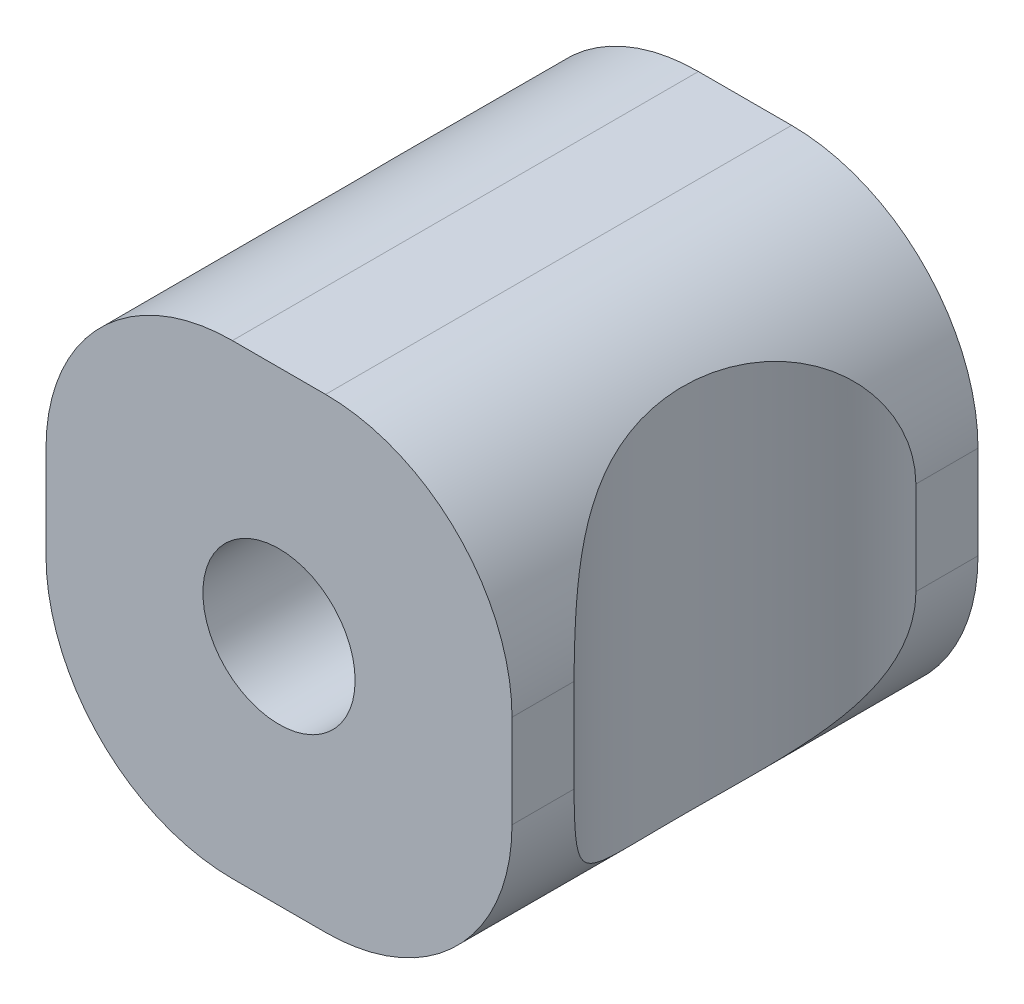
ISO-10303-21;
HEADER;
FILE_DESCRIPTION(('STEP AP214'),'2;1');
FILE_NAME('part.step','',(''),(''),'','','');
FILE_SCHEMA(('AUTOMOTIVE_DESIGN { 1 0 10303 214 1 1 1 1 }'));
ENDSEC;
DATA;
#1=APPLICATION_CONTEXT('core data for automotive mechanical design processes');
#2=APPLICATION_PROTOCOL_DEFINITION('international standard','automotive_design',2000,#1);
#3=PRODUCT_CONTEXT('',#1,'mechanical');
#4=PRODUCT('Part','Part','',(#3));
#5=PRODUCT_RELATED_PRODUCT_CATEGORY('part','',(#4));
#6=PRODUCT_DEFINITION_FORMATION('','',#4);
#7=PRODUCT_DEFINITION_CONTEXT('part definition',#1,'design');
#8=PRODUCT_DEFINITION('design','',#6,#7);
#9=PRODUCT_DEFINITION_SHAPE('','',#8);
#10=(LENGTH_UNIT() NAMED_UNIT(*) SI_UNIT(.MILLI.,.METRE.));
#11=(NAMED_UNIT(*) PLANE_ANGLE_UNIT() SI_UNIT($,.RADIAN.));
#12=(NAMED_UNIT(*) SI_UNIT($,.STERADIAN.) SOLID_ANGLE_UNIT());
#13=UNCERTAINTY_MEASURE_WITH_UNIT(LENGTH_MEASURE(1.E-05),#10,'distance_accuracy_value','');
#14=(GEOMETRIC_REPRESENTATION_CONTEXT(3) GLOBAL_UNCERTAINTY_ASSIGNED_CONTEXT((#13)) GLOBAL_UNIT_ASSIGNED_CONTEXT((#10,
#11,#12)) REPRESENTATION_CONTEXT('',''));
#15=CARTESIAN_POINT('',(0.,0.,0.));
#16=DIRECTION('',(0.,0.,1.));
#17=DIRECTION('',(1.,0.,0.));
#18=AXIS2_PLACEMENT_3D('',#15,#16,#17);
#19=CARTESIAN_POINT('',(7.5,7.5,15.));
#20=DIRECTION('',(-1.,0.,0.));
#21=DIRECTION('',(0.,-1.,0.));
#22=AXIS2_PLACEMENT_3D('',#19,#20,#21);
#23=PLANE('',#22);
#24=DIRECTION('',(0.,0.,-1.));
#25=VECTOR('',#24,1.);
#26=CARTESIAN_POINT('',(7.5,-1.5,15.));
#27=LINE('',#26,#25);
#28=CARTESIAN_POINT('',(7.5,-1.5,15.));
#29=VERTEX_POINT('',#28);
#30=CARTESIAN_POINT('',(7.5,-1.5,13.));
#31=VERTEX_POINT('',#30);
#32=EDGE_CURVE('E152',#29,#31,#27,.T.);
#33=ORIENTED_EDGE('',*,*,#32,.T.);
#34=DIRECTION('',(0.,1.,0.));
#35=VECTOR('',#34,1.);
#36=CARTESIAN_POINT('',(7.5,-7.5,13.));
#37=LINE('',#36,#35);
#38=CARTESIAN_POINT('',(7.5,1.5,13.));
#39=VERTEX_POINT('',#38);
#40=EDGE_CURVE('E132',#31,#39,#37,.T.);
#41=ORIENTED_EDGE('',*,*,#40,.T.);
#42=DIRECTION('',(0.,0.,-1.));
#43=VECTOR('',#42,1.);
#44=CARTESIAN_POINT('',(7.5,1.5,15.));
#45=LINE('',#44,#43);
#46=CARTESIAN_POINT('',(7.5,1.5,15.));
#47=VERTEX_POINT('',#46);
#48=EDGE_CURVE('E155',#39,#47,#45,.F.);
#49=ORIENTED_EDGE('',*,*,#48,.T.);
#50=DIRECTION('',(0.,1.,0.));
#51=VECTOR('',#50,1.);
#52=CARTESIAN_POINT('',(7.5,7.5,15.));
#53=LINE('',#52,#51);
#54=EDGE_CURVE('E239',#29,#47,#53,.T.);
#55=ORIENTED_EDGE('',*,*,#54,.F.);
#56=EDGE_LOOP('',(#33,#41,#49,#55));
#57=FACE_BOUND('',#56,.T.);
#58=ADVANCED_FACE('F37',(#57),#23,.F.);
#59=CARTESIAN_POINT('',(-7.5,7.5,15.));
#60=DIRECTION('',(1.,0.,0.));
#61=DIRECTION('',(0.,1.,0.));
#62=AXIS2_PLACEMENT_3D('',#59,#60,#61);
#63=PLANE('',#62);
#64=DIRECTION('',(0.,0.,-1.));
#65=VECTOR('',#64,1.);
#66=CARTESIAN_POINT('',(-7.5,1.5,15.));
#67=LINE('',#66,#65);
#68=CARTESIAN_POINT('',(-7.5,1.5,15.));
#69=VERTEX_POINT('',#68);
#70=CARTESIAN_POINT('',(-7.5,1.5,13.));
#71=VERTEX_POINT('',#70);
#72=EDGE_CURVE('E224',#69,#71,#67,.T.);
#73=ORIENTED_EDGE('',*,*,#72,.T.);
#74=DIRECTION('',(0.,-1.,0.));
#75=VECTOR('',#74,1.);
#76=CARTESIAN_POINT('',(-7.5,7.5,13.));
#77=LINE('',#76,#75);
#78=CARTESIAN_POINT('',(-7.5,-1.5,13.));
#79=VERTEX_POINT('',#78);
#80=EDGE_CURVE('E65',#71,#79,#77,.T.);
#81=ORIENTED_EDGE('',*,*,#80,.T.);
#82=DIRECTION('',(0.,0.,-1.));
#83=VECTOR('',#82,1.);
#84=CARTESIAN_POINT('',(-7.5,-1.5,15.));
#85=LINE('',#84,#83);
#86=CARTESIAN_POINT('',(-7.5,-1.5,15.));
#87=VERTEX_POINT('',#86);
#88=EDGE_CURVE('E215',#79,#87,#85,.F.);
#89=ORIENTED_EDGE('',*,*,#88,.T.);
#90=DIRECTION('',(0.,-1.,0.));
#91=VECTOR('',#90,1.);
#92=CARTESIAN_POINT('',(-7.5,7.5,15.));
#93=LINE('',#92,#91);
#94=EDGE_CURVE('E283',#69,#87,#93,.T.);
#95=ORIENTED_EDGE('',*,*,#94,.F.);
#96=EDGE_LOOP('',(#73,#81,#89,#95));
#97=FACE_BOUND('',#96,.T.);
#98=ADVANCED_FACE('F282',(#97),#63,.F.);
#99=CARTESIAN_POINT('',(7.5,1.5,0.));
#100=VERTEX_POINT('',#99);
#101=CARTESIAN_POINT('',(7.5,1.5,2.));
#102=VERTEX_POINT('',#101);
#103=EDGE_CURVE('E146',#100,#102,#45,.F.);
#104=ORIENTED_EDGE('',*,*,#103,.T.);
#105=DIRECTION('',(0.,1.,0.));
#106=VECTOR('',#105,1.);
#107=CARTESIAN_POINT('',(7.5,-7.5,2.));
#108=LINE('',#107,#106);
#109=CARTESIAN_POINT('',(7.5,-1.5,2.));
#110=VERTEX_POINT('',#109);
#111=EDGE_CURVE('E57',#110,#102,#108,.T.);
#112=ORIENTED_EDGE('',*,*,#111,.F.);
#113=CARTESIAN_POINT('',(7.5,-1.5,0.));
#114=VERTEX_POINT('',#113);
#115=EDGE_CURVE('E143',#110,#114,#27,.T.);
#116=ORIENTED_EDGE('',*,*,#115,.T.);
#117=DIRECTION('',(0.,1.,0.));
#118=VECTOR('',#117,1.);
#119=CARTESIAN_POINT('',(7.5,7.5,0.));
#120=LINE('',#119,#118);
#121=EDGE_CURVE('E262',#114,#100,#120,.T.);
#122=ORIENTED_EDGE('',*,*,#121,.T.);
#123=EDGE_LOOP('',(#104,#112,#116,#122));
#124=FACE_BOUND('',#123,.T.);
#125=ADVANCED_FACE('F141',(#124),#23,.F.);
#126=CARTESIAN_POINT('',(-7.5,7.5,15.));
#127=DIRECTION('',(0.,-1.,0.));
#128=DIRECTION('',(0.,0.,-1.));
#129=AXIS2_PLACEMENT_3D('',#126,#127,#128);
#130=PLANE('',#129);
#131=DIRECTION('',(-1.,0.,0.));
#132=VECTOR('',#131,1.);
#133=CARTESIAN_POINT('',(-7.5,7.5,15.));
#134=LINE('',#133,#132);
#135=CARTESIAN_POINT('',(1.5,7.5,15.));
#136=VERTEX_POINT('',#135);
#137=CARTESIAN_POINT('',(-1.5,7.5,15.));
#138=VERTEX_POINT('',#137);
#139=EDGE_CURVE('E246',#136,#138,#134,.T.);
#140=ORIENTED_EDGE('',*,*,#139,.F.);
#141=DIRECTION('',(0.,0.,-1.));
#142=VECTOR('',#141,1.);
#143=CARTESIAN_POINT('',(1.5,7.5,15.));
#144=LINE('',#143,#142);
#145=CARTESIAN_POINT('',(1.5,7.5,0.));
#146=VERTEX_POINT('',#145);
#147=EDGE_CURVE('E160',#136,#146,#144,.T.);
#148=ORIENTED_EDGE('',*,*,#147,.T.);
#149=DIRECTION('',(-1.,0.,0.));
#150=VECTOR('',#149,1.);
#151=CARTESIAN_POINT('',(-7.5,7.5,0.));
#152=LINE('',#151,#150);
#153=CARTESIAN_POINT('',(-1.5,7.5,0.));
#154=VERTEX_POINT('',#153);
#155=EDGE_CURVE('E255',#146,#154,#152,.T.);
#156=ORIENTED_EDGE('',*,*,#155,.T.);
#157=DIRECTION('',(0.,0.,-1.));
#158=VECTOR('',#157,1.);
#159=CARTESIAN_POINT('',(-1.5,7.5,15.));
#160=LINE('',#159,#158);
#161=EDGE_CURVE('E154',#154,#138,#160,.F.);
#162=ORIENTED_EDGE('',*,*,#161,.T.);
#163=EDGE_LOOP('',(#140,#148,#156,#162));
#164=FACE_BOUND('',#163,.T.);
#165=ADVANCED_FACE('F254',(#164),#130,.F.);
#166=CARTESIAN_POINT('',(-7.5,-1.5,0.));
#167=VERTEX_POINT('',#166);
#168=CARTESIAN_POINT('',(-7.5,-1.5,2.));
#169=VERTEX_POINT('',#168);
#170=EDGE_CURVE('E213',#167,#169,#85,.F.);
#171=ORIENTED_EDGE('',*,*,#170,.T.);
#172=DIRECTION('',(0.,-1.,0.));
#173=VECTOR('',#172,1.);
#174=CARTESIAN_POINT('',(-7.5,7.5,2.));
#175=LINE('',#174,#173);
#176=CARTESIAN_POINT('',(-7.5,1.5,2.));
#177=VERTEX_POINT('',#176);
#178=EDGE_CURVE('E137',#177,#169,#175,.T.);
#179=ORIENTED_EDGE('',*,*,#178,.F.);
#180=CARTESIAN_POINT('',(-7.5,1.5,0.));
#181=VERTEX_POINT('',#180);
#182=EDGE_CURVE('E279',#177,#181,#67,.T.);
#183=ORIENTED_EDGE('',*,*,#182,.T.);
#184=DIRECTION('',(0.,-1.,0.));
#185=VECTOR('',#184,1.);
#186=CARTESIAN_POINT('',(-7.5,7.5,0.));
#187=LINE('',#186,#185);
#188=EDGE_CURVE('E219',#181,#167,#187,.T.);
#189=ORIENTED_EDGE('',*,*,#188,.T.);
#190=EDGE_LOOP('',(#171,#179,#183,#189));
#191=FACE_BOUND('',#190,.T.);
#192=ADVANCED_FACE('F217',(#191),#63,.F.);
#193=CARTESIAN_POINT('',(-7.5,-7.5,15.));
#194=DIRECTION('',(0.,1.,0.));
#195=DIRECTION('',(0.,0.,1.));
#196=AXIS2_PLACEMENT_3D('',#193,#194,#195);
#197=PLANE('',#196);
#198=DIRECTION('',(1.,0.,0.));
#199=VECTOR('',#198,1.);
#200=CARTESIAN_POINT('',(-7.5,-7.5,15.));
#201=LINE('',#200,#199);
#202=CARTESIAN_POINT('',(-1.5,-7.5,15.));
#203=VERTEX_POINT('',#202);
#204=CARTESIAN_POINT('',(1.5,-7.5,15.));
#205=VERTEX_POINT('',#204);
#206=EDGE_CURVE('E273',#203,#205,#201,.T.);
#207=ORIENTED_EDGE('',*,*,#206,.F.);
#208=DIRECTION('',(0.,0.,-1.));
#209=VECTOR('',#208,1.);
#210=CARTESIAN_POINT('',(-1.5,-7.5,15.));
#211=LINE('',#210,#209);
#212=CARTESIAN_POINT('',(-1.5,-7.5,0.));
#213=VERTEX_POINT('',#212);
#214=EDGE_CURVE('E272',#203,#213,#211,.T.);
#215=ORIENTED_EDGE('',*,*,#214,.T.);
#216=DIRECTION('',(1.,0.,0.));
#217=VECTOR('',#216,1.);
#218=CARTESIAN_POINT('',(-7.5,-7.5,0.));
#219=LINE('',#218,#217);
#220=CARTESIAN_POINT('',(1.5,-7.5,0.));
#221=VERTEX_POINT('',#220);
#222=EDGE_CURVE('E247',#213,#221,#219,.T.);
#223=ORIENTED_EDGE('',*,*,#222,.T.);
#224=DIRECTION('',(0.,0.,-1.));
#225=VECTOR('',#224,1.);
#226=CARTESIAN_POINT('',(1.5,-7.5,15.));
#227=LINE('',#226,#225);
#228=EDGE_CURVE('E270',#221,#205,#227,.F.);
#229=ORIENTED_EDGE('',*,*,#228,.T.);
#230=EDGE_LOOP('',(#207,#215,#223,#229));
#231=FACE_BOUND('',#230,.T.);
#232=ADVANCED_FACE('F290',(#231),#197,.F.);
#233=CARTESIAN_POINT('',(0.,0.,15.));
#234=DIRECTION('',(0.,0.,1.));
#235=DIRECTION('',(1.,0.,0.));
#236=AXIS2_PLACEMENT_3D('',#233,#234,#235);
#237=PLANE('',#236);
#238=CARTESIAN_POINT('',(0.,0.,15.));
#239=DIRECTION('',(0.,0.,1.));
#240=DIRECTION('',(1.,0.,0.));
#241=AXIS2_PLACEMENT_3D('',#238,#239,#240);
#242=CIRCLE('',#241,2.45);
#243=CARTESIAN_POINT('',(2.45,0.,15.));
#244=VERTEX_POINT('',#243);
#245=EDGE_CURVE('E184',#244,#244,#242,.T.);
#246=ORIENTED_EDGE('',*,*,#245,.F.);
#247=EDGE_LOOP('',(#246));
#248=FACE_BOUND('',#247,.T.);
#249=ORIENTED_EDGE('',*,*,#94,.T.);
#250=CARTESIAN_POINT('',(-1.5,-1.5,15.));
#251=DIRECTION('',(0.,0.,1.));
#252=DIRECTION('',(1.,0.,0.));
#253=AXIS2_PLACEMENT_3D('',#250,#251,#252);
#254=CIRCLE('',#253,6.);
#255=EDGE_CURVE('E230',#87,#203,#254,.T.);
#256=ORIENTED_EDGE('',*,*,#255,.T.);
#257=ORIENTED_EDGE('',*,*,#206,.T.);
#258=CARTESIAN_POINT('',(1.5,-1.5,15.));
#259=DIRECTION('',(0.,0.,1.));
#260=DIRECTION('',(1.,0.,0.));
#261=AXIS2_PLACEMENT_3D('',#258,#259,#260);
#262=CIRCLE('',#261,6.);
#263=EDGE_CURVE('E229',#205,#29,#262,.T.);
#264=ORIENTED_EDGE('',*,*,#263,.T.);
#265=ORIENTED_EDGE('',*,*,#54,.T.);
#266=CARTESIAN_POINT('',(1.5,1.5,15.));
#267=DIRECTION('',(0.,0.,1.));
#268=DIRECTION('',(1.,0.,0.));
#269=AXIS2_PLACEMENT_3D('',#266,#267,#268);
#270=CIRCLE('',#269,6.);
#271=EDGE_CURVE('E222',#47,#136,#270,.T.);
#272=ORIENTED_EDGE('',*,*,#271,.T.);
#273=ORIENTED_EDGE('',*,*,#139,.T.);
#274=CARTESIAN_POINT('',(-1.5,1.5,15.));
#275=DIRECTION('',(0.,0.,1.));
#276=DIRECTION('',(1.,0.,0.));
#277=AXIS2_PLACEMENT_3D('',#274,#275,#276);
#278=CIRCLE('',#277,6.);
#279=EDGE_CURVE('E220',#138,#69,#278,.T.);
#280=ORIENTED_EDGE('',*,*,#279,.T.);
#281=EDGE_LOOP('',(#249,#256,#257,#264,#265,#272,#273,#280));
#282=FACE_BOUND('',#281,.T.);
#283=ADVANCED_FACE('F242',(#248,#282),#237,.T.);
#284=CARTESIAN_POINT('',(0.,0.,0.));
#285=DIRECTION('',(0.,0.,1.));
#286=DIRECTION('',(1.,0.,0.));
#287=AXIS2_PLACEMENT_3D('',#284,#285,#286);
#288=PLANE('',#287);
#289=ORIENTED_EDGE('',*,*,#222,.F.);
#290=CARTESIAN_POINT('',(-1.5,-1.5,0.));
#291=DIRECTION('',(0.,0.,1.));
#292=DIRECTION('',(1.,0.,0.));
#293=AXIS2_PLACEMENT_3D('',#290,#291,#292);
#294=CIRCLE('',#293,6.);
#295=EDGE_CURVE('E278',#213,#167,#294,.F.);
#296=ORIENTED_EDGE('',*,*,#295,.T.);
#297=ORIENTED_EDGE('',*,*,#188,.F.);
#298=CARTESIAN_POINT('',(-1.5,1.5,0.));
#299=DIRECTION('',(0.,0.,1.));
#300=DIRECTION('',(1.,0.,0.));
#301=AXIS2_PLACEMENT_3D('',#298,#299,#300);
#302=CIRCLE('',#301,6.);
#303=EDGE_CURVE('E261',#181,#154,#302,.F.);
#304=ORIENTED_EDGE('',*,*,#303,.T.);
#305=ORIENTED_EDGE('',*,*,#155,.F.);
#306=CARTESIAN_POINT('',(1.5,1.5,0.));
#307=DIRECTION('',(0.,0.,1.));
#308=DIRECTION('',(1.,0.,0.));
#309=AXIS2_PLACEMENT_3D('',#306,#307,#308);
#310=CIRCLE('',#309,6.);
#311=EDGE_CURVE('E250',#146,#100,#310,.F.);
#312=ORIENTED_EDGE('',*,*,#311,.T.);
#313=ORIENTED_EDGE('',*,*,#121,.F.);
#314=CARTESIAN_POINT('',(1.5,-1.5,0.));
#315=DIRECTION('',(0.,0.,1.));
#316=DIRECTION('',(1.,0.,0.));
#317=AXIS2_PLACEMENT_3D('',#314,#315,#316);
#318=CIRCLE('',#317,6.);
#319=EDGE_CURVE('E150',#114,#221,#318,.F.);
#320=ORIENTED_EDGE('',*,*,#319,.T.);
#321=EDGE_LOOP('',(#289,#296,#297,#304,#305,#312,#313,#320));
#322=FACE_BOUND('',#321,.T.);
#323=ADVANCED_FACE('F259',(#322),#288,.F.);
#324=CARTESIAN_POINT('',(0.,0.,5.));
#325=DIRECTION('',(0.,0.,1.));
#326=DIRECTION('',(1.,0.,0.));
#327=AXIS2_PLACEMENT_3D('',#324,#325,#326);
#328=CYLINDRICAL_SURFACE('',#327,2.45);
#329=CARTESIAN_POINT('',(0.,0.,5.));
#330=DIRECTION('',(0.,0.,1.));
#331=DIRECTION('',(1.,0.,0.));
#332=AXIS2_PLACEMENT_3D('',#329,#330,#331);
#333=CIRCLE('',#332,2.45);
#334=CARTESIAN_POINT('',(2.45,0.,5.));
#335=VERTEX_POINT('',#334);
#336=EDGE_CURVE('E186',#335,#335,#333,.T.);
#337=ORIENTED_EDGE('',*,*,#336,.F.);
#338=EDGE_LOOP('',(#337));
#339=FACE_BOUND('',#338,.T.);
#340=ORIENTED_EDGE('',*,*,#245,.T.);
#341=EDGE_LOOP('',(#340));
#342=FACE_BOUND('',#341,.T.);
#343=ADVANCED_FACE('F396',(#339,#342),#328,.F.);
#344=CARTESIAN_POINT('',(0.,0.,5.));
#345=DIRECTION('',(0.,0.,1.));
#346=DIRECTION('',(1.,0.,0.));
#347=AXIS2_PLACEMENT_3D('',#344,#345,#346);
#348=PLANE('',#347);
#349=ORIENTED_EDGE('',*,*,#336,.T.);
#350=EDGE_LOOP('',(#349));
#351=FACE_BOUND('',#350,.T.);
#352=ADVANCED_FACE('F172',(#351),#348,.T.);
#353=CARTESIAN_POINT('',(-1.5,-1.5,15.));
#354=DIRECTION('',(0.,0.,-1.));
#355=DIRECTION('',(-1.,0.,0.));
#356=AXIS2_PLACEMENT_3D('',#353,#354,#355);
#357=CYLINDRICAL_SURFACE('',#356,6.);
#358=CARTESIAN_POINT('',(-7.5,-1.5,2.));
#359=CARTESIAN_POINT('',(-7.50002404857424,-1.61256687190926,1.99999925949167));
#360=CARTESIAN_POINT('',(-7.49683312324728,-1.72513046825298,2.00377950726603));
#361=CARTESIAN_POINT('',(-7.48419493546309,-1.94938170838499,2.01889720139936));
#362=CARTESIAN_POINT('',(-7.47474847290634,-2.0610694623206,2.03023368153813));
#363=CARTESIAN_POINT('',(-7.44980392034766,-2.28245210195422,2.06042132897403));
#364=CARTESIAN_POINT('',(-7.43432099972977,-2.39215126736925,2.0792536619462));
#365=CARTESIAN_POINT('',(-7.3976406065648,-2.609019526754,2.12441569880627));
#366=CARTESIAN_POINT('',(-7.37644317307674,-2.71618863801134,2.15074535144964));
#367=CARTESIAN_POINT('',(-7.32878480762767,-2.92722542721304,2.21086454716305));
#368=CARTESIAN_POINT('',(-7.30232326326927,-3.03109271941006,2.24465495822657));
#369=CARTESIAN_POINT('',(-7.24470228845344,-3.23482229956922,2.31962585788643));
#370=CARTESIAN_POINT('',(-7.21354104218815,-3.33468302056332,2.3608092040412));
#371=CARTESIAN_POINT('',(-7.14721971174767,-3.52965587493604,2.45040563849978));
#372=CARTESIAN_POINT('',(-7.11206177306525,-3.62477051699771,2.49881485216323));
#373=CARTESIAN_POINT('',(-7.03849271786564,-3.80976830462762,2.60267527385834));
#374=CARTESIAN_POINT('',(-7.00008037707521,-3.89964945976464,2.6581291359688));
#375=CARTESIAN_POINT('',(-6.88147141484879,-4.16006630035942,2.83425903304444));
#376=CARTESIAN_POINT('',(-6.79760151750534,-4.32222907013774,2.96509585468399));
#377=CARTESIAN_POINT('',(-6.62687791154466,-4.62169461249579,3.25080943184904));
#378=CARTESIAN_POINT('',(-6.54002304225485,-4.75898758158669,3.40569562296917));
#379=CARTESIAN_POINT('',(-6.36168103601423,-5.0201313123863,3.75101641079101));
#380=CARTESIAN_POINT('',(-6.27050002768458,-5.14159304678909,3.94340872542384));
#381=CARTESIAN_POINT('',(-6.09844793701373,-5.3565943421833,4.34745949286852));
#382=CARTESIAN_POINT('',(-6.01758228121759,-5.45011924101065,4.55912798667565));
#383=CARTESIAN_POINT('',(-5.90166634241313,-5.57790446133262,4.90476703911668));
#384=CARTESIAN_POINT('',(-5.86162691392041,-5.62056804729744,5.03408401642191));
#385=CARTESIAN_POINT('',(-5.7872080785979,-5.69794463674898,5.29669638701399));
#386=CARTESIAN_POINT('',(-5.75282917772783,-5.73265692962692,5.42999213468208));
#387=CARTESIAN_POINT('',(-5.6902350282012,-5.79463260651792,5.69978265410738));
#388=CARTESIAN_POINT('',(-5.66202277599781,-5.82189237085839,5.83627894553898));
#389=CARTESIAN_POINT('',(-5.61214251375491,-5.86937846590774,6.11167345188594));
#390=CARTESIAN_POINT('',(-5.59047504447351,-5.88960421545695,6.25057186427298));
#391=CARTESIAN_POINT('',(-5.5509055842329,-5.92617374313284,6.55333029682975));
#392=CARTESIAN_POINT('',(-5.53422997823462,-5.94131166692222,6.71749824776955));
#393=CARTESIAN_POINT('',(-5.5103892509947,-5.96285036305846,7.04709990381175));
#394=CARTESIAN_POINT('',(-5.50322510164244,-5.96925024254581,7.21253373652633));
#395=CARTESIAN_POINT('',(-5.49850864602218,-5.97347065398791,7.54379052114755));
#396=CARTESIAN_POINT('',(-5.50096453841836,-5.97128386796777,7.70961368454114));
#397=CARTESIAN_POINT('',(-5.51547166543653,-5.95825982640702,8.04049952911523));
#398=CARTESIAN_POINT('',(-5.52752301587435,-5.94742246645519,8.20556220109252));
#399=CARTESIAN_POINT('',(-5.56236510277595,-5.91563087054742,8.54679461012343));
#400=CARTESIAN_POINT('',(-5.58592431454021,-5.89394953061876,8.72281960136356));
#401=CARTESIAN_POINT('',(-5.64358316254756,-5.83961827898493,9.07145264878948));
#402=CARTESIAN_POINT('',(-5.67768421195327,-5.80696689666413,9.24406024356092));
#403=CARTESIAN_POINT('',(-5.75569437334342,-5.72990171191713,9.58417689473805));
#404=CARTESIAN_POINT('',(-5.79959301095862,-5.68550046165245,9.75169118057302));
#405=CARTESIAN_POINT('',(-5.89619989405571,-5.58391219935112,10.0801593188032));
#406=CARTESIAN_POINT('',(-5.94890527390579,-5.52672934429214,10.2411152840925));
#407=CARTESIAN_POINT('',(-6.04813927093053,-5.41390150206076,10.5170321754056));
#408=CARTESIAN_POINT('',(-6.09311253155414,-5.36118380074465,10.6337576587293));
#409=CARTESIAN_POINT('',(-6.18649656429051,-5.24728878130392,10.8615646657724));
#410=CARTESIAN_POINT('',(-6.2349066806917,-5.18611307476812,10.9726472591879));
#411=CARTESIAN_POINT('',(-6.33415789436076,-5.05495060155074,11.1882533864597));
#412=CARTESIAN_POINT('',(-6.38499761449066,-4.9849687904173,11.2927805601262));
#413=CARTESIAN_POINT('',(-6.4879766379651,-4.83590940906887,11.4944741292139));
#414=CARTESIAN_POINT('',(-6.54011596721054,-4.75683165746025,11.5916403777775));
#415=CARTESIAN_POINT('',(-6.6447836753114,-4.58886135318112,11.7784866836479));
#416=CARTESIAN_POINT('',(-6.69731193718571,-4.49989747522346,11.8681028762599));
#417=CARTESIAN_POINT('',(-6.80088233785463,-4.3128400015099,12.0381971014719));
#418=CARTESIAN_POINT('',(-6.85192466284716,-4.214747556146,12.1186762826979));
#419=CARTESIAN_POINT('',(-6.95100502837301,-4.00987779764788,12.2698234413881));
#420=CARTESIAN_POINT('',(-6.99904342731273,-3.90310152411501,12.3404925905455));
#421=CARTESIAN_POINT('',(-7.09062192878084,-3.68158192135095,12.4714902080678));
#422=CARTESIAN_POINT('',(-7.13416283615149,-3.56684002376341,12.5318205278814));
#423=CARTESIAN_POINT('',(-7.21001626349293,-3.34594277056438,12.6345298737115));
#424=CARTESIAN_POINT('',(-7.24305236178796,-3.24064566712371,12.6782265587835));
#425=CARTESIAN_POINT('',(-7.30389401411943,-3.02554927401929,12.7573896084027));
#426=CARTESIAN_POINT('',(-7.33170021675025,-2.91575054469212,12.792856993648));
#427=CARTESIAN_POINT('',(-7.38138351791712,-2.69263390570974,12.8554352208899));
#428=CARTESIAN_POINT('',(-7.40326737953631,-2.57932017635259,12.8825555997454));
#429=CARTESIAN_POINT('',(-7.44061852257864,-2.3500234268674,12.9284403453893));
#430=CARTESIAN_POINT('',(-7.45608866848784,-2.23404162283378,12.9472084427394));
#431=CARTESIAN_POINT('',(-7.47872683644316,-2.01511887251608,12.974543249644));
#432=CARTESIAN_POINT('',(-7.48669704394678,-1.91238246094462,12.9840995113773));
#433=CARTESIAN_POINT('',(-7.4973368219732,-1.70643265588378,12.9968218649302));
#434=CARTESIAN_POINT('',(-7.50001613425974,-1.60322049039294,12.9999997010865));
#435=CARTESIAN_POINT('',(-7.5,-1.5,13.));
#436=B_SPLINE_CURVE_WITH_KNOTS('',3,(#358,#359,#360,#361,#362,#363,#364,#365,#366,#367,#368,
#369,#370,#371,#372,#373,#374,#375,#376,#377,#378,#379,#380,#381,#382,#383,#384,#385,#386,#387,
#388,#389,#390,#391,#392,#393,#394,#395,#396,#397,#398,#399,#400,#401,#402,#403,#404,#405,#406,
#407,#408,#409,#410,#411,#412,#413,#414,#415,#416,#417,#418,#419,#420,#421,#422,#423,#424,#425,
#426,#427,#428,#429,#430,#431,#432,#433,#434,#435),.UNSPECIFIED.,.F.,.F.,(4,2,2,2,2,2,2,2,2,2,2,
2,2,2,2,2,2,2,2,2,2,2,2,2,2,2,2,2,2,2,2,2,2,2,2,2,2,2,4),(0.,0.33758712137078,0.675131083542706,
1.01183222215537,1.34853105945547,1.68526908935743,2.02213755847658,2.35882603727902,
2.69564174212032,3.36634881297558,4.03731969889914,4.76985153812458,5.5027671612179,
5.92823648857022,6.35374382538532,6.77945746425699,7.20520626780536,7.7017942293682,
8.19843292884172,8.69549497985034,9.19256303041856,9.72863389650228,10.2647766555591,
10.8003489595347,11.3357473314366,11.7425955187119,12.1493662916713,12.5559091736017,
12.9624601643232,13.3721624073838,13.7818130890598,14.1914148005986,14.6009430849866,
14.9565570522838,15.3121268883905,15.6672889475578,16.022292213347,16.3324260652336,
16.6419883544454),.UNSPECIFIED.);
#437=EDGE_CURVE('E176',#169,#79,#436,.T.);
#438=ORIENTED_EDGE('',*,*,#437,.F.);
#439=ORIENTED_EDGE('',*,*,#170,.F.);
#440=ORIENTED_EDGE('',*,*,#295,.F.);
#441=ORIENTED_EDGE('',*,*,#214,.F.);
#442=ORIENTED_EDGE('',*,*,#255,.F.);
#443=ORIENTED_EDGE('',*,*,#88,.F.);
#444=EDGE_LOOP('',(#438,#439,#440,#441,#442,#443));
#445=FACE_BOUND('',#444,.T.);
#446=ADVANCED_FACE('F188',(#445),#357,.T.);
#447=CARTESIAN_POINT('',(1.5,-1.5,15.));
#448=DIRECTION('',(0.,0.,-1.));
#449=DIRECTION('',(-1.,0.,0.));
#450=AXIS2_PLACEMENT_3D('',#447,#448,#449);
#451=CYLINDRICAL_SURFACE('',#450,6.);
#452=CARTESIAN_POINT('',(7.5,-1.5,13.));
#453=CARTESIAN_POINT('',(7.50002404857424,-1.61256687190926,13.0000007405083));
#454=CARTESIAN_POINT('',(7.49683312324728,-1.72513046825298,12.996220492734));
#455=CARTESIAN_POINT('',(7.48419493546309,-1.94938170838499,12.9811027986006));
#456=CARTESIAN_POINT('',(7.47474847290634,-2.0610694623206,12.9697663184619));
#457=CARTESIAN_POINT('',(7.44980392034766,-2.28245210195422,12.939578671026));
#458=CARTESIAN_POINT('',(7.43432099972977,-2.39215126736925,12.9207463380538));
#459=CARTESIAN_POINT('',(7.3976406065648,-2.609019526754,12.8755843011937));
#460=CARTESIAN_POINT('',(7.37644317307674,-2.71618863801134,12.8492546485503));
#461=CARTESIAN_POINT('',(7.32878480762767,-2.92722542721303,12.7891354528369));
#462=CARTESIAN_POINT('',(7.30232326326927,-3.03109271941006,12.7553450417734));
#463=CARTESIAN_POINT('',(7.24470228845344,-3.23482229956922,12.6803741421136));
#464=CARTESIAN_POINT('',(7.21354104218815,-3.33468302056332,12.6391907959588));
#465=CARTESIAN_POINT('',(7.14721971174767,-3.52965587493604,12.5495943615002));
#466=CARTESIAN_POINT('',(7.11206177306525,-3.62477051699771,12.5011851478368));
#467=CARTESIAN_POINT('',(7.03849271786564,-3.80976830462762,12.3973247261416));
#468=CARTESIAN_POINT('',(7.00008037707521,-3.89964945976464,12.3418708640312));
#469=CARTESIAN_POINT('',(6.88147141484879,-4.16006630035942,12.1657409669556));
#470=CARTESIAN_POINT('',(6.79760151750534,-4.32222907013774,12.034904145316));
#471=CARTESIAN_POINT('',(6.62687791154466,-4.62169461249578,11.7491905681509));
#472=CARTESIAN_POINT('',(6.54002304225485,-4.75898758158668,11.5943043770308));
#473=CARTESIAN_POINT('',(6.36168103601423,-5.0201313123863,11.248983589209));
#474=CARTESIAN_POINT('',(6.27050002768458,-5.14159304678909,11.0565912745762));
#475=CARTESIAN_POINT('',(6.09844793701373,-5.3565943421833,10.6525405071315));
#476=CARTESIAN_POINT('',(6.01758228121759,-5.45011924101065,10.4408720133243));
#477=CARTESIAN_POINT('',(5.90166634241313,-5.57790446133262,10.0952329608833));
#478=CARTESIAN_POINT('',(5.86162691392041,-5.62056804729744,9.96591598357808));
#479=CARTESIAN_POINT('',(5.7872080785979,-5.69794463674898,9.703303612986));
#480=CARTESIAN_POINT('',(5.75282917772783,-5.73265692962692,9.57000786531791));
#481=CARTESIAN_POINT('',(5.6902350282012,-5.79463260651792,9.30021734589261));
#482=CARTESIAN_POINT('',(5.66202277599781,-5.82189237085839,9.16372105446101));
#483=CARTESIAN_POINT('',(5.61214251375491,-5.86937846590774,8.88832654811405));
#484=CARTESIAN_POINT('',(5.59047504447351,-5.88960421545695,8.74942813572701));
#485=CARTESIAN_POINT('',(5.5509055842329,-5.92617374313284,8.44666970317024));
#486=CARTESIAN_POINT('',(5.53422997823462,-5.94131166692222,8.28250175223044));
#487=CARTESIAN_POINT('',(5.5103892509947,-5.96285036305846,7.95290009618824));
#488=CARTESIAN_POINT('',(5.50322510164244,-5.96925024254581,7.78746626347367));
#489=CARTESIAN_POINT('',(5.49850864602218,-5.97347065398791,7.45620947885244));
#490=CARTESIAN_POINT('',(5.50096453841836,-5.97128386796777,7.29038631545885));
#491=CARTESIAN_POINT('',(5.51547166543653,-5.95825982640702,6.95950047088476));
#492=CARTESIAN_POINT('',(5.52752301587435,-5.94742246645519,6.79443779890747));
#493=CARTESIAN_POINT('',(5.56236510277596,-5.91563087054742,6.45320538987656));
#494=CARTESIAN_POINT('',(5.58592431454021,-5.89394953061876,6.27718039863643));
#495=CARTESIAN_POINT('',(5.64358316254756,-5.83961827898493,5.92854735121052));
#496=CARTESIAN_POINT('',(5.67768421195327,-5.80696689666413,5.75593975643908));
#497=CARTESIAN_POINT('',(5.75569437334342,-5.72990171191713,5.41582310526194));
#498=CARTESIAN_POINT('',(5.79959301095862,-5.68550046165245,5.24830881942698));
#499=CARTESIAN_POINT('',(5.89619989405571,-5.58391219935112,4.91984068119683));
#500=CARTESIAN_POINT('',(5.94890527390579,-5.52672934429214,4.75888471590753));
#501=CARTESIAN_POINT('',(6.04813927093053,-5.41390150206076,4.48296782459434));
#502=CARTESIAN_POINT('',(6.09311253155414,-5.36118380074465,4.36624234127072));
#503=CARTESIAN_POINT('',(6.18649656429051,-5.24728878130392,4.13843533422761));
#504=CARTESIAN_POINT('',(6.2349066806917,-5.18611307476812,4.02735274081212));
#505=CARTESIAN_POINT('',(6.33415789436076,-5.05495060155074,3.81174661354029));
#506=CARTESIAN_POINT('',(6.38499761449066,-4.9849687904173,3.70721943987377));
#507=CARTESIAN_POINT('',(6.4879766379651,-4.83590940906887,3.50552587078605));
#508=CARTESIAN_POINT('',(6.54011596721054,-4.75683165746024,3.40835962222247));
#509=CARTESIAN_POINT('',(6.6447836753114,-4.58886135318112,3.22151331635206));
#510=CARTESIAN_POINT('',(6.69731193718571,-4.49989747522346,3.13189712374006));
#511=CARTESIAN_POINT('',(6.80088233785463,-4.3128400015099,2.9618028985281));
#512=CARTESIAN_POINT('',(6.85192466284716,-4.21474755614599,2.88132371730212));
#513=CARTESIAN_POINT('',(6.95100502837301,-4.00987779764788,2.73017655861186));
#514=CARTESIAN_POINT('',(6.99904342731273,-3.90310152411501,2.6595074094545));
#515=CARTESIAN_POINT('',(7.09062192878084,-3.68158192135096,2.52850979193217));
#516=CARTESIAN_POINT('',(7.13416283615149,-3.56684002376341,2.4681794721186));
#517=CARTESIAN_POINT('',(7.21001626349293,-3.34594277056438,2.36547012628853));
#518=CARTESIAN_POINT('',(7.24305236178796,-3.24064566712371,2.32177344121646));
#519=CARTESIAN_POINT('',(7.30389401411943,-3.02554927401929,2.24261039159726));
#520=CARTESIAN_POINT('',(7.33170021675025,-2.91575054469212,2.20714300635195));
#521=CARTESIAN_POINT('',(7.38138351791712,-2.69263390570974,2.14456477911005));
#522=CARTESIAN_POINT('',(7.40326737953631,-2.57932017635259,2.11744440025464));
#523=CARTESIAN_POINT('',(7.44061852257864,-2.3500234268674,2.07155965461068));
#524=CARTESIAN_POINT('',(7.45608866848784,-2.23404162283378,2.05279155726056));
#525=CARTESIAN_POINT('',(7.47872683644315,-2.01511887251608,2.02545675035603));
#526=CARTESIAN_POINT('',(7.48669704394678,-1.91238246094462,2.01590048862268));
#527=CARTESIAN_POINT('',(7.49733682197319,-1.70643265588378,2.0031781350698));
#528=CARTESIAN_POINT('',(7.50001613425974,-1.60322049039294,2.00000029891354));
#529=CARTESIAN_POINT('',(7.5,-1.5,2.));
#530=B_SPLINE_CURVE_WITH_KNOTS('',3,(#452,#453,#454,#455,#456,#457,#458,#459,#460,#461,#462,
#463,#464,#465,#466,#467,#468,#469,#470,#471,#472,#473,#474,#475,#476,#477,#478,#479,#480,#481,
#482,#483,#484,#485,#486,#487,#488,#489,#490,#491,#492,#493,#494,#495,#496,#497,#498,#499,#500,
#501,#502,#503,#504,#505,#506,#507,#508,#509,#510,#511,#512,#513,#514,#515,#516,#517,#518,#519,
#520,#521,#522,#523,#524,#525,#526,#527,#528,#529),.UNSPECIFIED.,.F.,.F.,(4,2,2,2,2,2,2,2,2,2,2,
2,2,2,2,2,2,2,2,2,2,2,2,2,2,2,2,2,2,2,2,2,2,2,2,2,2,2,4),(0.,0.33758712137078,0.675131083542705,
1.01183222215537,1.34853105945547,1.68526908935743,2.02213755847658,2.35882603727902,
2.69564174212032,3.36634881297558,4.03731969889914,4.76985153812458,5.5027671612179,
5.92823648857023,6.35374382538532,6.77945746425699,7.20520626780536,7.7017942293682,
8.19843292884172,8.69549497985034,9.19256303041856,9.72863389650227,10.2647766555591,
10.8003489595347,11.3357473314366,11.7425955187119,12.1493662916713,12.5559091736017,
12.9624601643232,13.3721624073838,13.7818130890598,14.1914148005986,14.6009430849866,
14.9565570522838,15.3121268883904,15.6672889475578,16.022292213347,16.3324260652336,
16.6419883544454),.UNSPECIFIED.);
#531=EDGE_CURVE('E129',#31,#110,#530,.T.);
#532=ORIENTED_EDGE('',*,*,#531,.F.);
#533=ORIENTED_EDGE('',*,*,#32,.F.);
#534=ORIENTED_EDGE('',*,*,#263,.F.);
#535=ORIENTED_EDGE('',*,*,#228,.F.);
#536=ORIENTED_EDGE('',*,*,#319,.F.);
#537=ORIENTED_EDGE('',*,*,#115,.F.);
#538=EDGE_LOOP('',(#532,#533,#534,#535,#536,#537));
#539=FACE_BOUND('',#538,.T.);
#540=ADVANCED_FACE('F148',(#539),#451,.T.);
#541=CARTESIAN_POINT('',(1.5,1.5,15.));
#542=DIRECTION('',(0.,0.,-1.));
#543=DIRECTION('',(-1.,0.,0.));
#544=AXIS2_PLACEMENT_3D('',#541,#542,#543);
#545=CYLINDRICAL_SURFACE('',#544,6.);
#546=CARTESIAN_POINT('',(7.5,1.5,2.));
#547=CARTESIAN_POINT('',(7.50002404857424,1.61256687190926,1.99999925949167));
#548=CARTESIAN_POINT('',(7.49683312324728,1.72513046825298,2.00377950726603));
#549=CARTESIAN_POINT('',(7.48419493546309,1.94938170838499,2.01889720139936));
#550=CARTESIAN_POINT('',(7.47474847290634,2.0610694623206,2.03023368153813));
#551=CARTESIAN_POINT('',(7.44980392034766,2.28245210195422,2.06042132897403));
#552=CARTESIAN_POINT('',(7.43432099972977,2.39215126736925,2.0792536619462));
#553=CARTESIAN_POINT('',(7.3976406065648,2.609019526754,2.12441569880627));
#554=CARTESIAN_POINT('',(7.37644317307673,2.71618863801134,2.15074535144964));
#555=CARTESIAN_POINT('',(7.32878480762767,2.92722542721304,2.21086454716305));
#556=CARTESIAN_POINT('',(7.30232326326927,3.03109271941006,2.24465495822657));
#557=CARTESIAN_POINT('',(7.24470228845344,3.23482229956922,2.31962585788643));
#558=CARTESIAN_POINT('',(7.21354104218815,3.33468302056332,2.3608092040412));
#559=CARTESIAN_POINT('',(7.14721971174767,3.52965587493604,2.45040563849978));
#560=CARTESIAN_POINT('',(7.11206177306525,3.62477051699771,2.49881485216324));
#561=CARTESIAN_POINT('',(7.03849271786564,3.80976830462762,2.60267527385834));
#562=CARTESIAN_POINT('',(7.00008037707521,3.89964945976464,2.6581291359688));
#563=CARTESIAN_POINT('',(6.88147141484879,4.16006630035942,2.83425903304444));
#564=CARTESIAN_POINT('',(6.79760151750534,4.32222907013774,2.96509585468399));
#565=CARTESIAN_POINT('',(6.62687791154466,4.62169461249578,3.25080943184904));
#566=CARTESIAN_POINT('',(6.54002304225485,4.75898758158669,3.40569562296917));
#567=CARTESIAN_POINT('',(6.36168103601423,5.0201313123863,3.75101641079101));
#568=CARTESIAN_POINT('',(6.27050002768458,5.14159304678909,3.94340872542384));
#569=CARTESIAN_POINT('',(6.09844793701373,5.3565943421833,4.34745949286852));
#570=CARTESIAN_POINT('',(6.01758228121759,5.45011924101065,4.55912798667565));
#571=CARTESIAN_POINT('',(5.90166634241313,5.57790446133262,4.90476703911668));
#572=CARTESIAN_POINT('',(5.86162691392041,5.62056804729744,5.03408401642191));
#573=CARTESIAN_POINT('',(5.7872080785979,5.69794463674898,5.29669638701399));
#574=CARTESIAN_POINT('',(5.75282917772783,5.73265692962692,5.42999213468208));
#575=CARTESIAN_POINT('',(5.6902350282012,5.79463260651792,5.69978265410738));
#576=CARTESIAN_POINT('',(5.66202277599781,5.82189237085839,5.83627894553898));
#577=CARTESIAN_POINT('',(5.61214251375491,5.86937846590774,6.11167345188594));
#578=CARTESIAN_POINT('',(5.59047504447351,5.88960421545695,6.25057186427298));
#579=CARTESIAN_POINT('',(5.5509055842329,5.92617374313284,6.55333029682975));
#580=CARTESIAN_POINT('',(5.53422997823462,5.94131166692222,6.71749824776955));
#581=CARTESIAN_POINT('',(5.5103892509947,5.96285036305846,7.04709990381176));
#582=CARTESIAN_POINT('',(5.50322510164244,5.96925024254581,7.21253373652633));
#583=CARTESIAN_POINT('',(5.49850864602218,5.97347065398791,7.54379052114755));
#584=CARTESIAN_POINT('',(5.50096453841836,5.97128386796777,7.70961368454114));
#585=CARTESIAN_POINT('',(5.51547166543653,5.95825982640702,8.04049952911523));
#586=CARTESIAN_POINT('',(5.52752301587435,5.94742246645519,8.20556220109252));
#587=CARTESIAN_POINT('',(5.56236510277596,5.91563087054742,8.54679461012343));
#588=CARTESIAN_POINT('',(5.58592431454021,5.89394953061876,8.72281960136356));
#589=CARTESIAN_POINT('',(5.64358316254756,5.83961827898493,9.07145264878948));
#590=CARTESIAN_POINT('',(5.67768421195327,5.80696689666413,9.24406024356092));
#591=CARTESIAN_POINT('',(5.75569437334342,5.72990171191713,9.58417689473805));
#592=CARTESIAN_POINT('',(5.79959301095862,5.68550046165245,9.75169118057302));
#593=CARTESIAN_POINT('',(5.89619989405571,5.58391219935112,10.0801593188032));
#594=CARTESIAN_POINT('',(5.9489052739058,5.52672934429214,10.2411152840925));
#595=CARTESIAN_POINT('',(6.04813927093054,5.41390150206075,10.5170321754056));
#596=CARTESIAN_POINT('',(6.09311253155414,5.36118380074465,10.6337576587293));
#597=CARTESIAN_POINT('',(6.18649656429051,5.24728878130392,10.8615646657724));
#598=CARTESIAN_POINT('',(6.2349066806917,5.18611307476812,10.9726472591879));
#599=CARTESIAN_POINT('',(6.33415789436076,5.05495060155074,11.1882533864597));
#600=CARTESIAN_POINT('',(6.38499761449067,4.9849687904173,11.2927805601262));
#601=CARTESIAN_POINT('',(6.48797663796511,4.83590940906887,11.4944741292139));
#602=CARTESIAN_POINT('',(6.54011596721054,4.75683165746024,11.5916403777775));
#603=CARTESIAN_POINT('',(6.6447836753114,4.58886135318111,11.7784866836479));
#604=CARTESIAN_POINT('',(6.69731193718571,4.49989747522345,11.8681028762599));
#605=CARTESIAN_POINT('',(6.80088233785463,4.3128400015099,12.0381971014719));
#606=CARTESIAN_POINT('',(6.85192466284716,4.21474755614599,12.1186762826979));
#607=CARTESIAN_POINT('',(6.95100502837301,4.00987779764788,12.2698234413881));
#608=CARTESIAN_POINT('',(6.99904342731273,3.903101524115,12.3404925905455));
#609=CARTESIAN_POINT('',(7.09062192878084,3.68158192135095,12.4714902080678));
#610=CARTESIAN_POINT('',(7.13416283615149,3.5668400237634,12.5318205278814));
#611=CARTESIAN_POINT('',(7.21001626349294,3.34594277056437,12.6345298737115));
#612=CARTESIAN_POINT('',(7.24305236178796,3.2406456671237,12.6782265587835));
#613=CARTESIAN_POINT('',(7.30389401411943,3.02554927401928,12.7573896084027));
#614=CARTESIAN_POINT('',(7.33170021675025,2.91575054469211,12.792856993648));
#615=CARTESIAN_POINT('',(7.38138351791712,2.69263390570973,12.8554352208899));
#616=CARTESIAN_POINT('',(7.40326737953631,2.57932017635258,12.8825555997454));
#617=CARTESIAN_POINT('',(7.44061852257864,2.35002342686739,12.9284403453893));
#618=CARTESIAN_POINT('',(7.45608866848784,2.23404162283377,12.9472084427394));
#619=CARTESIAN_POINT('',(7.47872683644315,2.01511887251607,12.974543249644));
#620=CARTESIAN_POINT('',(7.48669704394678,1.91238246094462,12.9840995113773));
#621=CARTESIAN_POINT('',(7.49733682197319,1.70643265588378,12.9968218649302));
#622=CARTESIAN_POINT('',(7.50001613425974,1.60322049039294,12.9999997010864));
#623=CARTESIAN_POINT('',(7.5,1.5,13.));
#624=B_SPLINE_CURVE_WITH_KNOTS('',3,(#546,#547,#548,#549,#550,#551,#552,#553,#554,#555,#556,
#557,#558,#559,#560,#561,#562,#563,#564,#565,#566,#567,#568,#569,#570,#571,#572,#573,#574,#575,
#576,#577,#578,#579,#580,#581,#582,#583,#584,#585,#586,#587,#588,#589,#590,#591,#592,#593,#594,
#595,#596,#597,#598,#599,#600,#601,#602,#603,#604,#605,#606,#607,#608,#609,#610,#611,#612,#613,
#614,#615,#616,#617,#618,#619,#620,#621,#622,#623),.UNSPECIFIED.,.F.,.F.,(4,2,2,2,2,2,2,2,2,2,2,
2,2,2,2,2,2,2,2,2,2,2,2,2,2,2,2,2,2,2,2,2,2,2,2,2,2,2,4),(0.,0.337587121370779,
0.675131083542704,1.01183222215537,1.34853105945547,1.68526908935743,2.02213755847658,
2.35882603727902,2.69564174212032,3.36634881297558,4.03731969889914,4.76985153812458,
5.5027671612179,5.92823648857022,6.35374382538532,6.77945746425699,7.20520626780536,
7.7017942293682,8.19843292884172,8.69549497985034,9.19256303041856,9.72863389650228,
10.2647766555591,10.8003489595347,11.3357473314366,11.7425955187119,12.1493662916713,
12.5559091736017,12.9624601643232,13.3721624073838,13.7818130890598,14.1914148005986,
14.6009430849866,14.9565570522838,15.3121268883905,15.6672889475578,16.022292213347,
16.3324260652336,16.6419883544454),.UNSPECIFIED.);
#625=EDGE_CURVE('E11',#102,#39,#624,.T.);
#626=ORIENTED_EDGE('',*,*,#625,.F.);
#627=ORIENTED_EDGE('',*,*,#103,.F.);
#628=ORIENTED_EDGE('',*,*,#311,.F.);
#629=ORIENTED_EDGE('',*,*,#147,.F.);
#630=ORIENTED_EDGE('',*,*,#271,.F.);
#631=ORIENTED_EDGE('',*,*,#48,.F.);
#632=EDGE_LOOP('',(#626,#627,#628,#629,#630,#631));
#633=FACE_BOUND('',#632,.T.);
#634=ADVANCED_FACE('F197',(#633),#545,.T.);
#635=CARTESIAN_POINT('',(-1.5,1.5,15.));
#636=DIRECTION('',(0.,0.,-1.));
#637=DIRECTION('',(-1.,0.,0.));
#638=AXIS2_PLACEMENT_3D('',#635,#636,#637);
#639=CYLINDRICAL_SURFACE('',#638,6.);
#640=CARTESIAN_POINT('',(-7.5,1.5,13.));
#641=CARTESIAN_POINT('',(-7.50002404857424,1.61256687190926,13.0000007405083));
#642=CARTESIAN_POINT('',(-7.49683312324728,1.72513046825298,12.996220492734));
#643=CARTESIAN_POINT('',(-7.48419493546309,1.94938170838499,12.9811027986006));
#644=CARTESIAN_POINT('',(-7.47474847290634,2.0610694623206,12.9697663184619));
#645=CARTESIAN_POINT('',(-7.44980392034766,2.28245210195422,12.939578671026));
#646=CARTESIAN_POINT('',(-7.43432099972977,2.39215126736925,12.9207463380538));
#647=CARTESIAN_POINT('',(-7.3976406065648,2.609019526754,12.8755843011937));
#648=CARTESIAN_POINT('',(-7.37644317307674,2.71618863801134,12.8492546485503));
#649=CARTESIAN_POINT('',(-7.32878480762767,2.92722542721303,12.7891354528369));
#650=CARTESIAN_POINT('',(-7.30232326326927,3.03109271941006,12.7553450417734));
#651=CARTESIAN_POINT('',(-7.24470228845344,3.23482229956922,12.6803741421136));
#652=CARTESIAN_POINT('',(-7.21354104218815,3.33468302056332,12.6391907959588));
#653=CARTESIAN_POINT('',(-7.14721971174767,3.52965587493604,12.5495943615002));
#654=CARTESIAN_POINT('',(-7.11206177306525,3.62477051699771,12.5011851478368));
#655=CARTESIAN_POINT('',(-7.03849271786564,3.80976830462762,12.3973247261416));
#656=CARTESIAN_POINT('',(-7.00008037707521,3.89964945976464,12.3418708640312));
#657=CARTESIAN_POINT('',(-6.88147141484879,4.16006630035942,12.1657409669556));
#658=CARTESIAN_POINT('',(-6.79760151750534,4.32222907013774,12.034904145316));
#659=CARTESIAN_POINT('',(-6.62687791154466,4.62169461249578,11.749190568151));
#660=CARTESIAN_POINT('',(-6.54002304225485,4.75898758158668,11.5943043770308));
#661=CARTESIAN_POINT('',(-6.36168103601423,5.0201313123863,11.248983589209));
#662=CARTESIAN_POINT('',(-6.27050002768458,5.14159304678909,11.0565912745762));
#663=CARTESIAN_POINT('',(-6.09844793701373,5.3565943421833,10.6525405071315));
#664=CARTESIAN_POINT('',(-6.01758228121759,5.45011924101065,10.4408720133243));
#665=CARTESIAN_POINT('',(-5.90166634241313,5.57790446133262,10.0952329608833));
#666=CARTESIAN_POINT('',(-5.86162691392041,5.62056804729744,9.96591598357808));
#667=CARTESIAN_POINT('',(-5.7872080785979,5.69794463674898,9.703303612986));
#668=CARTESIAN_POINT('',(-5.75282917772784,5.73265692962692,9.57000786531791));
#669=CARTESIAN_POINT('',(-5.6902350282012,5.79463260651792,9.30021734589261));
#670=CARTESIAN_POINT('',(-5.66202277599781,5.82189237085839,9.16372105446101));
#671=CARTESIAN_POINT('',(-5.61214251375491,5.86937846590774,8.88832654811405));
#672=CARTESIAN_POINT('',(-5.59047504447351,5.88960421545695,8.74942813572701));
#673=CARTESIAN_POINT('',(-5.5509055842329,5.92617374313284,8.44666970317024));
#674=CARTESIAN_POINT('',(-5.53422997823462,5.94131166692222,8.28250175223044));
#675=CARTESIAN_POINT('',(-5.5103892509947,5.96285036305846,7.95290009618824));
#676=CARTESIAN_POINT('',(-5.50322510164244,5.96925024254581,7.78746626347367));
#677=CARTESIAN_POINT('',(-5.49850864602218,5.97347065398791,7.45620947885244));
#678=CARTESIAN_POINT('',(-5.50096453841836,5.97128386796777,7.29038631545885));
#679=CARTESIAN_POINT('',(-5.51547166543653,5.95825982640702,6.95950047088476));
#680=CARTESIAN_POINT('',(-5.52752301587435,5.94742246645519,6.79443779890747));
#681=CARTESIAN_POINT('',(-5.56236510277595,5.91563087054742,6.45320538987656));
#682=CARTESIAN_POINT('',(-5.58592431454021,5.89394953061877,6.27718039863643));
#683=CARTESIAN_POINT('',(-5.64358316254756,5.83961827898493,5.92854735121052));
#684=CARTESIAN_POINT('',(-5.67768421195327,5.80696689666413,5.75593975643908));
#685=CARTESIAN_POINT('',(-5.75569437334342,5.72990171191713,5.41582310526194));
#686=CARTESIAN_POINT('',(-5.79959301095862,5.68550046165245,5.24830881942698));
#687=CARTESIAN_POINT('',(-5.89619989405571,5.58391219935112,4.91984068119683));
#688=CARTESIAN_POINT('',(-5.94890527390579,5.52672934429214,4.75888471590753));
#689=CARTESIAN_POINT('',(-6.04813927093053,5.41390150206076,4.48296782459435));
#690=CARTESIAN_POINT('',(-6.09311253155414,5.36118380074465,4.36624234127072));
#691=CARTESIAN_POINT('',(-6.18649656429051,5.24728878130392,4.13843533422761));
#692=CARTESIAN_POINT('',(-6.2349066806917,5.18611307476812,4.02735274081212));
#693=CARTESIAN_POINT('',(-6.33415789436076,5.05495060155074,3.81174661354029));
#694=CARTESIAN_POINT('',(-6.38499761449066,4.9849687904173,3.70721943987377));
#695=CARTESIAN_POINT('',(-6.4879766379651,4.83590940906887,3.50552587078605));
#696=CARTESIAN_POINT('',(-6.54011596721054,4.75683165746025,3.40835962222247));
#697=CARTESIAN_POINT('',(-6.6447836753114,4.58886135318112,3.22151331635206));
#698=CARTESIAN_POINT('',(-6.69731193718571,4.49989747522346,3.13189712374006));
#699=CARTESIAN_POINT('',(-6.80088233785463,4.31284000150991,2.96180289852811));
#700=CARTESIAN_POINT('',(-6.85192466284716,4.214747556146,2.88132371730213));
#701=CARTESIAN_POINT('',(-6.95100502837301,4.00987779764789,2.73017655861187));
#702=CARTESIAN_POINT('',(-6.99904342731273,3.90310152411502,2.6595074094545));
#703=CARTESIAN_POINT('',(-7.09062192878084,3.68158192135096,2.52850979193217));
#704=CARTESIAN_POINT('',(-7.13416283615149,3.56684002376341,2.4681794721186));
#705=CARTESIAN_POINT('',(-7.21001626349293,3.34594277056439,2.36547012628853));
#706=CARTESIAN_POINT('',(-7.24305236178796,3.24064566712371,2.32177344121646));
#707=CARTESIAN_POINT('',(-7.30389401411943,3.0255492740193,2.24261039159726));
#708=CARTESIAN_POINT('',(-7.33170021675025,2.91575054469212,2.20714300635194));
#709=CARTESIAN_POINT('',(-7.38138351791712,2.69263390570974,2.14456477911004));
#710=CARTESIAN_POINT('',(-7.40326737953631,2.5793201763526,2.11744440025464));
#711=CARTESIAN_POINT('',(-7.44061852257864,2.35002342686741,2.07155965461068));
#712=CARTESIAN_POINT('',(-7.45608866848784,2.23404162283379,2.05279155726056));
#713=CARTESIAN_POINT('',(-7.47872683644316,2.01511887251608,2.02545675035602));
#714=CARTESIAN_POINT('',(-7.48669704394678,1.91238246094463,2.01590048862268));
#715=CARTESIAN_POINT('',(-7.49733682197319,1.70643265588378,2.0031781350698));
#716=CARTESIAN_POINT('',(-7.50001613425974,1.60322049039294,2.00000029891355));
#717=CARTESIAN_POINT('',(-7.5,1.5,2.));
#718=B_SPLINE_CURVE_WITH_KNOTS('',3,(#640,#641,#642,#643,#644,#645,#646,#647,#648,#649,#650,
#651,#652,#653,#654,#655,#656,#657,#658,#659,#660,#661,#662,#663,#664,#665,#666,#667,#668,#669,
#670,#671,#672,#673,#674,#675,#676,#677,#678,#679,#680,#681,#682,#683,#684,#685,#686,#687,#688,
#689,#690,#691,#692,#693,#694,#695,#696,#697,#698,#699,#700,#701,#702,#703,#704,#705,#706,#707,
#708,#709,#710,#711,#712,#713,#714,#715,#716,#717),.UNSPECIFIED.,.F.,.F.,(4,2,2,2,2,2,2,2,2,2,2,
2,2,2,2,2,2,2,2,2,2,2,2,2,2,2,2,2,2,2,2,2,2,2,2,2,2,2,4),(0.,0.337587121370779,
0.675131083542704,1.01183222215537,1.34853105945547,1.68526908935743,2.02213755847658,
2.35882603727902,2.69564174212032,3.36634881297558,4.03731969889914,4.76985153812458,
5.5027671612179,5.92823648857022,6.35374382538532,6.77945746425699,7.20520626780536,
7.7017942293682,8.19843292884172,8.69549497985034,9.19256303041856,9.72863389650227,
10.2647766555591,10.8003489595347,11.3357473314366,11.7425955187119,12.1493662916713,
12.5559091736017,12.9624601643232,13.3721624073838,13.7818130890598,14.1914148005986,
14.6009430849866,14.9565570522838,15.3121268883905,15.6672889475578,16.022292213347,
16.3324260652336,16.6419883544454),.UNSPECIFIED.);
#719=EDGE_CURVE('E51',#71,#177,#718,.T.);
#720=ORIENTED_EDGE('',*,*,#719,.F.);
#721=ORIENTED_EDGE('',*,*,#72,.F.);
#722=ORIENTED_EDGE('',*,*,#279,.F.);
#723=ORIENTED_EDGE('',*,*,#161,.F.);
#724=ORIENTED_EDGE('',*,*,#303,.F.);
#725=ORIENTED_EDGE('',*,*,#182,.F.);
#726=EDGE_LOOP('',(#720,#721,#722,#723,#724,#725));
#727=FACE_BOUND('',#726,.T.);
#728=ADVANCED_FACE('F39',(#727),#639,.T.);
#729=CARTESIAN_POINT('',(-14.0625,7.5,7.5));
#730=DIRECTION('',(0.,-1.,0.));
#731=DIRECTION('',(0.,0.,-1.));
#732=AXIS2_PLACEMENT_3D('',#729,#730,#731);
#733=CYLINDRICAL_SURFACE('',#732,8.56249999999999);
#734=ORIENTED_EDGE('',*,*,#437,.T.);
#735=ORIENTED_EDGE('',*,*,#80,.F.);
#736=ORIENTED_EDGE('',*,*,#719,.T.);
#737=ORIENTED_EDGE('',*,*,#178,.T.);
#738=EDGE_LOOP('',(#734,#735,#736,#737));
#739=FACE_BOUND('',#738,.T.);
#740=ADVANCED_FACE('F167',(#739),#733,.F.);
#741=CARTESIAN_POINT('',(14.0625,-7.5,7.5));
#742=DIRECTION('',(0.,1.,0.));
#743=DIRECTION('',(0.,0.,1.));
#744=AXIS2_PLACEMENT_3D('',#741,#742,#743);
#745=CYLINDRICAL_SURFACE('',#744,8.56249999999999);
#746=ORIENTED_EDGE('',*,*,#531,.T.);
#747=ORIENTED_EDGE('',*,*,#111,.T.);
#748=ORIENTED_EDGE('',*,*,#625,.T.);
#749=ORIENTED_EDGE('',*,*,#40,.F.);
#750=EDGE_LOOP('',(#746,#747,#748,#749));
#751=FACE_BOUND('',#750,.T.);
#752=ADVANCED_FACE('F130',(#751),#745,.F.);
#753=CLOSED_SHELL('',(#58,#98,#125,#165,#192,#232,#283,#323,#343,#352,#446,#540,#634,#728,#740,#752));
#754=MANIFOLD_SOLID_BREP('B2',#753);
#755=ADVANCED_BREP_SHAPE_REPRESENTATION('',(#18,#754),#14);
#756=SHAPE_DEFINITION_REPRESENTATION(#9,#755);
ENDSEC;
END-ISO-10303-21;
